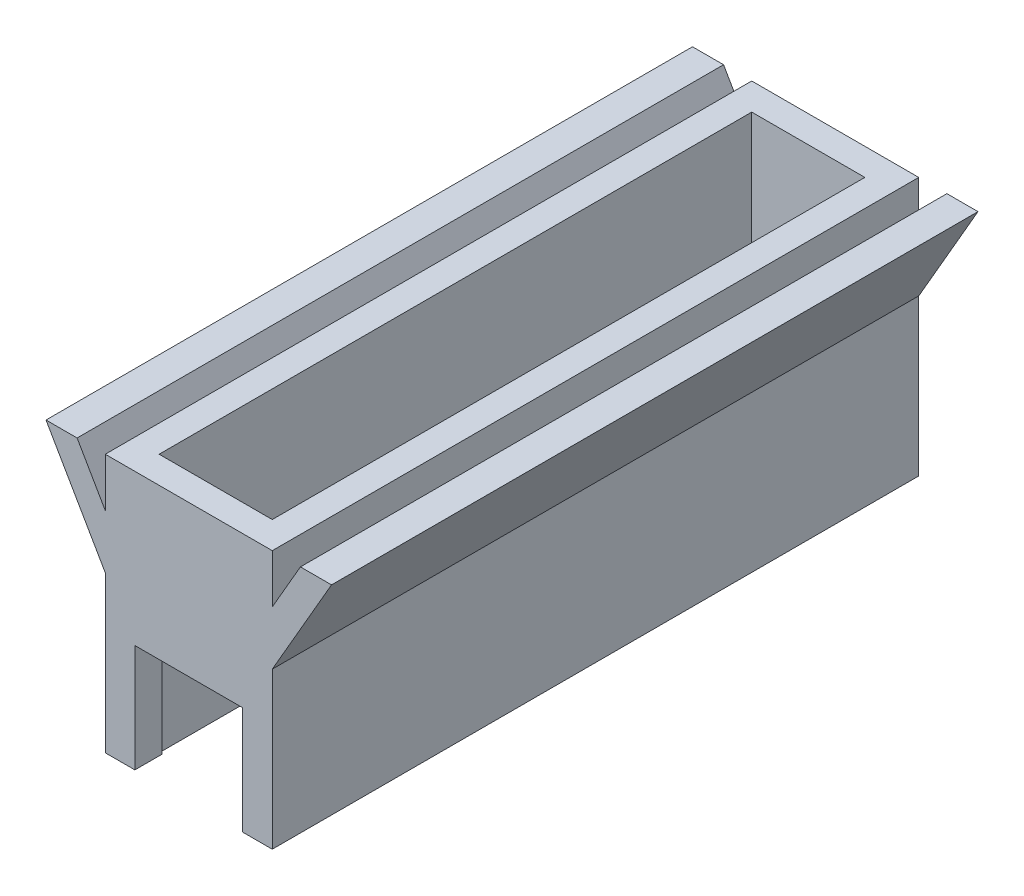
ISO-10303-21;
HEADER;
FILE_DESCRIPTION(('STEP AP214'),'2;1');
FILE_NAME('part.step','',(''),(''),'','','');
FILE_SCHEMA(('AUTOMOTIVE_DESIGN { 1 0 10303 214 1 1 1 1 }'));
ENDSEC;
DATA;
#1=APPLICATION_CONTEXT('core data for automotive mechanical design processes');
#2=APPLICATION_PROTOCOL_DEFINITION('international standard','automotive_design',2000,#1);
#3=PRODUCT_CONTEXT('',#1,'mechanical');
#4=PRODUCT('Part','Part','',(#3));
#5=PRODUCT_RELATED_PRODUCT_CATEGORY('part','',(#4));
#6=PRODUCT_DEFINITION_FORMATION('','',#4);
#7=PRODUCT_DEFINITION_CONTEXT('part definition',#1,'design');
#8=PRODUCT_DEFINITION('design','',#6,#7);
#9=PRODUCT_DEFINITION_SHAPE('','',#8);
#10=(LENGTH_UNIT() NAMED_UNIT(*) SI_UNIT(.MILLI.,.METRE.));
#11=(NAMED_UNIT(*) PLANE_ANGLE_UNIT() SI_UNIT($,.RADIAN.));
#12=(NAMED_UNIT(*) SI_UNIT($,.STERADIAN.) SOLID_ANGLE_UNIT());
#13=UNCERTAINTY_MEASURE_WITH_UNIT(LENGTH_MEASURE(1.E-05),#10,'distance_accuracy_value','');
#14=(GEOMETRIC_REPRESENTATION_CONTEXT(3) GLOBAL_UNCERTAINTY_ASSIGNED_CONTEXT((#13)) GLOBAL_UNIT_ASSIGNED_CONTEXT((#10,
#11,#12)) REPRESENTATION_CONTEXT('',''));
#15=CARTESIAN_POINT('',(0.,0.,0.));
#16=DIRECTION('',(0.,0.,1.));
#17=DIRECTION('',(1.,0.,0.));
#18=AXIS2_PLACEMENT_3D('',#15,#16,#17);
#19=CARTESIAN_POINT('',(24.2592802955411,48.,-4.99202551834131));
#20=DIRECTION('',(-1.,0.,0.));
#21=DIRECTION('',(0.,0.,1.));
#22=AXIS2_PLACEMENT_3D('',#19,#20,#21);
#23=PLANE('',#22);
#24=DIRECTION('',(0.,0.,1.));
#25=VECTOR('',#24,1.);
#26=CARTESIAN_POINT('',(24.2592802955411,38.9474411167422,-4.99202551834139));
#27=LINE('',#26,#25);
#28=CARTESIAN_POINT('',(24.2592802955411,38.9474411167422,-4.99202551834139));
#29=VERTEX_POINT('',#28);
#30=CARTESIAN_POINT('',(24.2592802955411,38.9474411167422,115.007974481659));
#31=VERTEX_POINT('',#30);
#32=EDGE_CURVE('E202',#29,#31,#27,.T.);
#33=ORIENTED_EDGE('',*,*,#32,.F.);
#34=DIRECTION('',(0.,-1.,0.));
#35=VECTOR('',#34,1.);
#36=CARTESIAN_POINT('',(24.2592802955411,48.,-4.99202551834131));
#37=LINE('',#36,#35);
#38=CARTESIAN_POINT('',(24.2592802955411,48.,-4.99202551834131));
#39=VERTEX_POINT('',#38);
#40=EDGE_CURVE('E215',#39,#29,#37,.T.);
#41=ORIENTED_EDGE('',*,*,#40,.F.);
#42=DIRECTION('',(0.,0.,-1.));
#43=VECTOR('',#42,1.);
#44=CARTESIAN_POINT('',(24.2592802955411,48.,-4.99202551834131));
#45=LINE('',#44,#43);
#46=CARTESIAN_POINT('',(24.2592802955411,48.,115.007974481659));
#47=VERTEX_POINT('',#46);
#48=EDGE_CURVE('E327',#47,#39,#45,.T.);
#49=ORIENTED_EDGE('',*,*,#48,.F.);
#50=DIRECTION('',(0.,-1.,0.));
#51=VECTOR('',#50,1.);
#52=CARTESIAN_POINT('',(24.2592802955411,48.,115.007974481659));
#53=LINE('',#52,#51);
#54=EDGE_CURVE('E218',#47,#31,#53,.T.);
#55=ORIENTED_EDGE('',*,*,#54,.T.);
#56=EDGE_LOOP('',(#33,#41,#49,#55));
#57=FACE_BOUND('',#56,.T.);
#58=ADVANCED_FACE('F38',(#57),#23,.F.);
#59=CARTESIAN_POINT('',(-6.74071970445887,48.,-4.99202551834131));
#60=DIRECTION('',(1.,0.,0.));
#61=DIRECTION('',(0.,0.,-1.));
#62=AXIS2_PLACEMENT_3D('',#59,#60,#61);
#63=PLANE('',#62);
#64=DIRECTION('',(0.,0.,1.));
#65=VECTOR('',#64,1.);
#66=CARTESIAN_POINT('',(-6.74071970445886,28.9474411167421,-4.99202551834139));
#67=LINE('',#66,#65);
#68=CARTESIAN_POINT('',(-6.74071970445886,28.9474411167421,-4.99202551834139));
#69=VERTEX_POINT('',#68);
#70=CARTESIAN_POINT('',(-6.74071970445886,28.9474411167421,115.007974481659));
#71=VERTEX_POINT('',#70);
#72=EDGE_CURVE('E355',#69,#71,#67,.T.);
#73=ORIENTED_EDGE('',*,*,#72,.F.);
#74=DIRECTION('',(0.,-1.,0.));
#75=VECTOR('',#74,1.);
#76=CARTESIAN_POINT('',(-6.74071970445887,48.,-4.99202551834131));
#77=LINE('',#76,#75);
#78=CARTESIAN_POINT('',(-6.74071970445887,0.,-4.99202551834131));
#79=VERTEX_POINT('',#78);
#80=EDGE_CURVE('E330',#69,#79,#77,.T.);
#81=ORIENTED_EDGE('',*,*,#80,.T.);
#82=DIRECTION('',(0.,0.,1.));
#83=VECTOR('',#82,1.);
#84=CARTESIAN_POINT('',(-6.74071970445887,0.,-4.99202551834131));
#85=LINE('',#84,#83);
#86=CARTESIAN_POINT('',(-6.74071970445886,0.,115.007974481659));
#87=VERTEX_POINT('',#86);
#88=EDGE_CURVE('E320',#79,#87,#85,.T.);
#89=ORIENTED_EDGE('',*,*,#88,.T.);
#90=DIRECTION('',(0.,-1.,0.));
#91=VECTOR('',#90,1.);
#92=CARTESIAN_POINT('',(-6.74071970445886,48.,115.007974481659));
#93=LINE('',#92,#91);
#94=EDGE_CURVE('E234',#71,#87,#93,.T.);
#95=ORIENTED_EDGE('',*,*,#94,.F.);
#96=EDGE_LOOP('',(#73,#81,#89,#95));
#97=FACE_BOUND('',#96,.T.);
#98=ADVANCED_FACE('F354',(#97),#63,.F.);
#99=CARTESIAN_POINT('',(0.,0.,0.));
#100=DIRECTION('',(0.,1.,0.));
#101=DIRECTION('',(0.,0.,1.));
#102=AXIS2_PLACEMENT_3D('',#99,#100,#101);
#103=PLANE('',#102);
#104=DIRECTION('',(0.,0.,1.));
#105=VECTOR('',#104,1.);
#106=CARTESIAN_POINT('',(18.7592802955411,0.,-20.9920255183414));
#107=LINE('',#106,#105);
#108=CARTESIAN_POINT('',(18.7592802955411,0.,-4.99202551834131));
#109=VERTEX_POINT('',#108);
#110=CARTESIAN_POINT('',(18.7592802955411,0.,0.00797448165869297));
#111=VERTEX_POINT('',#110);
#112=EDGE_CURVE('E270',#109,#111,#107,.T.);
#113=ORIENTED_EDGE('',*,*,#112,.F.);
#114=DIRECTION('',(-1.,0.,0.));
#115=VECTOR('',#114,1.);
#116=CARTESIAN_POINT('',(-6.74071970445887,0.,-4.99202551834131));
#117=LINE('',#116,#115);
#118=CARTESIAN_POINT('',(24.2592802955411,0.,-4.99202551834131));
#119=VERTEX_POINT('',#118);
#120=EDGE_CURVE('E325',#119,#109,#117,.T.);
#121=ORIENTED_EDGE('',*,*,#120,.F.);
#122=DIRECTION('',(0.,0.,-1.));
#123=VECTOR('',#122,1.);
#124=CARTESIAN_POINT('',(24.2592802955411,0.,-4.99202551834131));
#125=LINE('',#124,#123);
#126=CARTESIAN_POINT('',(24.2592802955411,0.,115.007974481659));
#127=VERTEX_POINT('',#126);
#128=EDGE_CURVE('E337',#127,#119,#125,.T.);
#129=ORIENTED_EDGE('',*,*,#128,.F.);
#130=DIRECTION('',(1.,0.,0.));
#131=VECTOR('',#130,1.);
#132=CARTESIAN_POINT('',(-6.74071970445886,0.,115.007974481659));
#133=LINE('',#132,#131);
#134=CARTESIAN_POINT('',(18.7592802955411,0.,115.007974481659));
#135=VERTEX_POINT('',#134);
#136=EDGE_CURVE('E333',#135,#127,#133,.T.);
#137=ORIENTED_EDGE('',*,*,#136,.F.);
#138=CARTESIAN_POINT('',(18.7592802955411,0.,110.007974481659));
#139=VERTEX_POINT('',#138);
#140=EDGE_CURVE('E271',#139,#135,#107,.T.);
#141=ORIENTED_EDGE('',*,*,#140,.F.);
#142=DIRECTION('',(1.,0.,0.));
#143=VECTOR('',#142,1.);
#144=CARTESIAN_POINT('',(-1.74071970445887,0.,110.007974481659));
#145=LINE('',#144,#143);
#146=CARTESIAN_POINT('',(19.2592802955411,0.,110.007974481659));
#147=VERTEX_POINT('',#146);
#148=EDGE_CURVE('E301',#139,#147,#145,.T.);
#149=ORIENTED_EDGE('',*,*,#148,.T.);
#150=DIRECTION('',(0.,0.,-1.));
#151=VECTOR('',#150,1.);
#152=CARTESIAN_POINT('',(19.2592802955411,0.,0.00797448165869297));
#153=LINE('',#152,#151);
#154=CARTESIAN_POINT('',(19.2592802955411,0.,0.00797448165869297));
#155=VERTEX_POINT('',#154);
#156=EDGE_CURVE('E305',#147,#155,#153,.T.);
#157=ORIENTED_EDGE('',*,*,#156,.T.);
#158=DIRECTION('',(-1.,0.,0.));
#159=VECTOR('',#158,1.);
#160=CARTESIAN_POINT('',(-1.74071970445887,0.,0.00797448165869297));
#161=LINE('',#160,#159);
#162=EDGE_CURVE('E291',#155,#111,#161,.T.);
#163=ORIENTED_EDGE('',*,*,#162,.T.);
#164=EDGE_LOOP('',(#113,#121,#129,#137,#141,#149,#157,#163));
#165=FACE_BOUND('',#164,.T.);
#166=ADVANCED_FACE('F421',(#165),#103,.F.);
#167=CARTESIAN_POINT('',(0.,48.,0.));
#168=DIRECTION('',(0.,1.,0.));
#169=DIRECTION('',(0.,0.,1.));
#170=AXIS2_PLACEMENT_3D('',#167,#168,#169);
#171=PLANE('',#170);
#172=DIRECTION('',(0.,0.,1.));
#173=VECTOR('',#172,1.);
#174=CARTESIAN_POINT('',(-6.74071970445887,48.,-4.99202551834131));
#175=LINE('',#174,#173);
#176=CARTESIAN_POINT('',(-6.74071970445887,48.,-4.99202551834131));
#177=VERTEX_POINT('',#176);
#178=CARTESIAN_POINT('',(-6.74071970445886,48.,115.007974481659));
#179=VERTEX_POINT('',#178);
#180=EDGE_CURVE('E321',#177,#179,#175,.T.);
#181=ORIENTED_EDGE('',*,*,#180,.T.);
#182=DIRECTION('',(1.,0.,0.));
#183=VECTOR('',#182,1.);
#184=CARTESIAN_POINT('',(-6.74071970445886,48.,115.007974481659));
#185=LINE('',#184,#183);
#186=EDGE_CURVE('E324',#179,#47,#185,.T.);
#187=ORIENTED_EDGE('',*,*,#186,.T.);
#188=ORIENTED_EDGE('',*,*,#48,.T.);
#189=DIRECTION('',(-1.,0.,0.));
#190=VECTOR('',#189,1.);
#191=CARTESIAN_POINT('',(-6.74071970445887,48.,-4.99202551834131));
#192=LINE('',#191,#190);
#193=EDGE_CURVE('E225',#39,#177,#192,.T.);
#194=ORIENTED_EDGE('',*,*,#193,.T.);
#195=EDGE_LOOP('',(#181,#187,#188,#194));
#196=FACE_BOUND('',#195,.T.);
#197=DIRECTION('',(1.,0.,0.));
#198=VECTOR('',#197,1.);
#199=CARTESIAN_POINT('',(-1.74071970445887,48.,110.007974481659));
#200=LINE('',#199,#198);
#201=CARTESIAN_POINT('',(-1.74071970445887,48.,110.007974481659));
#202=VERTEX_POINT('',#201);
#203=CARTESIAN_POINT('',(19.2592802955411,48.,110.007974481659));
#204=VERTEX_POINT('',#203);
#205=EDGE_CURVE('E290',#202,#204,#200,.T.);
#206=ORIENTED_EDGE('',*,*,#205,.F.);
#207=DIRECTION('',(0.,0.,1.));
#208=VECTOR('',#207,1.);
#209=CARTESIAN_POINT('',(-1.74071970445887,48.,0.00797448165869297));
#210=LINE('',#209,#208);
#211=CARTESIAN_POINT('',(-1.74071970445887,48.,0.00797448165869297));
#212=VERTEX_POINT('',#211);
#213=EDGE_CURVE('E288',#212,#202,#210,.T.);
#214=ORIENTED_EDGE('',*,*,#213,.F.);
#215=DIRECTION('',(-1.,0.,0.));
#216=VECTOR('',#215,1.);
#217=CARTESIAN_POINT('',(-1.74071970445887,48.,0.00797448165869297));
#218=LINE('',#217,#216);
#219=CARTESIAN_POINT('',(19.2592802955411,48.,0.00797448165869297));
#220=VERTEX_POINT('',#219);
#221=EDGE_CURVE('E296',#220,#212,#218,.T.);
#222=ORIENTED_EDGE('',*,*,#221,.F.);
#223=DIRECTION('',(0.,0.,-1.));
#224=VECTOR('',#223,1.);
#225=CARTESIAN_POINT('',(19.2592802955411,48.,0.00797448165869297));
#226=LINE('',#225,#224);
#227=EDGE_CURVE('E293',#204,#220,#226,.T.);
#228=ORIENTED_EDGE('',*,*,#227,.F.);
#229=EDGE_LOOP('',(#206,#214,#222,#228));
#230=FACE_BOUND('',#229,.T.);
#231=ADVANCED_FACE('F490',(#196,#230),#171,.T.);
#232=CARTESIAN_POINT('',(-1.24071970445887,0.,-4.99202551834131));
#233=VERTEX_POINT('',#232);
#234=EDGE_CURVE('E339',#233,#79,#117,.T.);
#235=ORIENTED_EDGE('',*,*,#234,.F.);
#236=DIRECTION('',(0.,0.,1.));
#237=VECTOR('',#236,1.);
#238=CARTESIAN_POINT('',(-1.24071970445887,0.,-20.9920255183414));
#239=LINE('',#238,#237);
#240=CARTESIAN_POINT('',(-1.24071970445887,0.,0.00797448165869297));
#241=VERTEX_POINT('',#240);
#242=EDGE_CURVE('E264',#233,#241,#239,.T.);
#243=ORIENTED_EDGE('',*,*,#242,.T.);
#244=CARTESIAN_POINT('',(-1.74071970445887,0.,0.00797448165869297));
#245=VERTEX_POINT('',#244);
#246=EDGE_CURVE('E308',#241,#245,#161,.T.);
#247=ORIENTED_EDGE('',*,*,#246,.T.);
#248=DIRECTION('',(0.,0.,1.));
#249=VECTOR('',#248,1.);
#250=CARTESIAN_POINT('',(-1.74071970445887,0.,0.00797448165869297));
#251=LINE('',#250,#249);
#252=CARTESIAN_POINT('',(-1.74071970445887,0.,110.007974481659));
#253=VERTEX_POINT('',#252);
#254=EDGE_CURVE('E287',#245,#253,#251,.T.);
#255=ORIENTED_EDGE('',*,*,#254,.T.);
#256=CARTESIAN_POINT('',(-1.24071970445887,0.,110.007974481659));
#257=VERTEX_POINT('',#256);
#258=EDGE_CURVE('E302',#253,#257,#145,.T.);
#259=ORIENTED_EDGE('',*,*,#258,.T.);
#260=CARTESIAN_POINT('',(-1.24071970445887,0.,115.007974481659));
#261=VERTEX_POINT('',#260);
#262=EDGE_CURVE('E260',#257,#261,#239,.T.);
#263=ORIENTED_EDGE('',*,*,#262,.T.);
#264=EDGE_CURVE('E334',#87,#261,#133,.T.);
#265=ORIENTED_EDGE('',*,*,#264,.F.);
#266=ORIENTED_EDGE('',*,*,#88,.F.);
#267=EDGE_LOOP('',(#235,#243,#247,#255,#259,#263,#265,#266));
#268=FACE_BOUND('',#267,.T.);
#269=ADVANCED_FACE('F350',(#268),#103,.F.);
#270=CARTESIAN_POINT('',(-6.74071970445886,38.9474411167422,-4.99202551834139));
#271=VERTEX_POINT('',#270);
#272=EDGE_CURVE('E230',#177,#271,#77,.T.);
#273=ORIENTED_EDGE('',*,*,#272,.T.);
#274=DIRECTION('',(0.,0.,1.));
#275=VECTOR('',#274,1.);
#276=CARTESIAN_POINT('',(-6.74071970445886,38.9474411167422,-4.99202551834139));
#277=LINE('',#276,#275);
#278=CARTESIAN_POINT('',(-6.74071970445886,38.9474411167422,115.007974481659));
#279=VERTEX_POINT('',#278);
#280=EDGE_CURVE('E360',#271,#279,#277,.T.);
#281=ORIENTED_EDGE('',*,*,#280,.T.);
#282=EDGE_CURVE('E235',#179,#279,#93,.T.);
#283=ORIENTED_EDGE('',*,*,#282,.F.);
#284=ORIENTED_EDGE('',*,*,#180,.F.);
#285=EDGE_LOOP('',(#273,#281,#283,#284));
#286=FACE_BOUND('',#285,.T.);
#287=ADVANCED_FACE('F40',(#286),#63,.F.);
#288=CARTESIAN_POINT('',(-6.74071970445886,48.,115.007974481659));
#289=DIRECTION('',(0.,0.,-1.));
#290=DIRECTION('',(-1.,0.,0.));
#291=AXIS2_PLACEMENT_3D('',#288,#289,#290);
#292=PLANE('',#291);
#293=ORIENTED_EDGE('',*,*,#264,.T.);
#294=DIRECTION('',(0.,-1.,0.));
#295=VECTOR('',#294,1.);
#296=CARTESIAN_POINT('',(-1.24071970445887,20.,115.007974481659));
#297=LINE('',#296,#295);
#298=CARTESIAN_POINT('',(-1.24071970445887,20.,115.007974481659));
#299=VERTEX_POINT('',#298);
#300=EDGE_CURVE('E273',#299,#261,#297,.T.);
#301=ORIENTED_EDGE('',*,*,#300,.F.);
#302=DIRECTION('',(1.,0.,0.));
#303=VECTOR('',#302,1.);
#304=CARTESIAN_POINT('',(-1.24071970445887,20.,115.007974481659));
#305=LINE('',#304,#303);
#306=CARTESIAN_POINT('',(18.7592802955411,20.,115.007974481659));
#307=VERTEX_POINT('',#306);
#308=EDGE_CURVE('E388',#299,#307,#305,.T.);
#309=ORIENTED_EDGE('',*,*,#308,.T.);
#310=DIRECTION('',(0.,-1.,0.));
#311=VECTOR('',#310,1.);
#312=CARTESIAN_POINT('',(18.7592802955411,20.,115.007974481659));
#313=LINE('',#312,#311);
#314=EDGE_CURVE('E381',#307,#135,#313,.T.);
#315=ORIENTED_EDGE('',*,*,#314,.T.);
#316=ORIENTED_EDGE('',*,*,#136,.T.);
#317=CARTESIAN_POINT('',(24.2592802955411,28.9474411167421,115.007974481659));
#318=VERTEX_POINT('',#317);
#319=EDGE_CURVE('E226',#318,#127,#53,.T.);
#320=ORIENTED_EDGE('',*,*,#319,.F.);
#321=DIRECTION('',(0.499999999999995,0.866025403784442,0.));
#322=VECTOR('',#321,1.);
#323=CARTESIAN_POINT('',(5.65985053082965,-3.2677162275475,115.007974481659));
#324=LINE('',#323,#322);
#325=CARTESIAN_POINT('',(35.2592802955411,48.,115.007974481659));
#326=VERTEX_POINT('',#325);
#327=EDGE_CURVE('E53',#318,#326,#324,.T.);
#328=ORIENTED_EDGE('',*,*,#327,.T.);
#329=DIRECTION('',(1.,0.,0.));
#330=VECTOR('',#329,1.);
#331=CARTESIAN_POINT('',(0.,48.,115.007974481659));
#332=LINE('',#331,#330);
#333=CARTESIAN_POINT('',(29.4857776036449,48.,115.007974481659));
#334=VERTEX_POINT('',#333);
#335=EDGE_CURVE('E209',#334,#326,#332,.T.);
#336=ORIENTED_EDGE('',*,*,#335,.F.);
#337=DIRECTION('',(0.499999999999995,0.866025403784442,0.));
#338=VECTOR('',#337,1.);
#339=CARTESIAN_POINT('',(1.32972351190745,-0.767716227547528,115.007974481659));
#340=LINE('',#339,#338);
#341=EDGE_CURVE('E439',#31,#334,#340,.T.);
#342=ORIENTED_EDGE('',*,*,#341,.F.);
#343=ORIENTED_EDGE('',*,*,#54,.F.);
#344=ORIENTED_EDGE('',*,*,#186,.F.);
#345=ORIENTED_EDGE('',*,*,#282,.T.);
#346=DIRECTION('',(-0.499999999999995,0.866025403784442,0.));
#347=VECTOR('',#346,1.);
#348=CARTESIAN_POINT('',(11.8091969314043,6.8180430272595,115.007974481659));
#349=LINE('',#348,#347);
#350=CARTESIAN_POINT('',(-11.9672170125626,48.,115.007974481659));
#351=VERTEX_POINT('',#350);
#352=EDGE_CURVE('E61',#279,#351,#349,.T.);
#353=ORIENTED_EDGE('',*,*,#352,.T.);
#354=DIRECTION('',(1.,0.,0.));
#355=VECTOR('',#354,1.);
#356=CARTESIAN_POINT('',(0.,48.,115.007974481659));
#357=LINE('',#356,#355);
#358=CARTESIAN_POINT('',(-17.7407197044589,48.,115.007974481659));
#359=VERTEX_POINT('',#358);
#360=EDGE_CURVE('E369',#359,#351,#357,.T.);
#361=ORIENTED_EDGE('',*,*,#360,.F.);
#362=DIRECTION('',(-0.499999999999995,0.866025403784442,0.));
#363=VECTOR('',#362,1.);
#364=CARTESIAN_POINT('',(7.47906991248214,4.31804302725953,115.007974481659));
#365=LINE('',#364,#363);
#366=EDGE_CURVE('E372',#71,#359,#365,.T.);
#367=ORIENTED_EDGE('',*,*,#366,.F.);
#368=ORIENTED_EDGE('',*,*,#94,.T.);
#369=EDGE_LOOP('',(#293,#301,#309,#315,#316,#320,#328,#336,#342,#343,#344,#345,#353,#361,#367,#368));
#370=FACE_BOUND('',#369,.T.);
#371=ADVANCED_FACE('F397',(#370),#292,.F.);
#372=CARTESIAN_POINT('',(24.2592802955411,28.9474411167421,-4.99202551834139));
#373=VERTEX_POINT('',#372);
#374=EDGE_CURVE('E227',#373,#119,#37,.T.);
#375=ORIENTED_EDGE('',*,*,#374,.F.);
#376=DIRECTION('',(0.,0.,1.));
#377=VECTOR('',#376,1.);
#378=CARTESIAN_POINT('',(24.2592802955411,28.9474411167421,-4.99202551834139));
#379=LINE('',#378,#377);
#380=EDGE_CURVE('E219',#373,#318,#379,.T.);
#381=ORIENTED_EDGE('',*,*,#380,.T.);
#382=ORIENTED_EDGE('',*,*,#319,.T.);
#383=ORIENTED_EDGE('',*,*,#128,.T.);
#384=EDGE_LOOP('',(#375,#381,#382,#383));
#385=FACE_BOUND('',#384,.T.);
#386=ADVANCED_FACE('F417',(#385),#23,.F.);
#387=CARTESIAN_POINT('',(-6.74071970445887,48.,-4.99202551834131));
#388=DIRECTION('',(0.,0.,1.));
#389=DIRECTION('',(1.,0.,0.));
#390=AXIS2_PLACEMENT_3D('',#387,#388,#389);
#391=PLANE('',#390);
#392=DIRECTION('',(1.,0.,0.));
#393=VECTOR('',#392,1.);
#394=CARTESIAN_POINT('',(-6.74071970445886,20.,-4.99202551834131));
#395=LINE('',#394,#393);
#396=CARTESIAN_POINT('',(-1.24071970445887,20.,-4.99202551834131));
#397=VERTEX_POINT('',#396);
#398=CARTESIAN_POINT('',(18.7592802955411,20.,-4.99202551834131));
#399=VERTEX_POINT('',#398);
#400=EDGE_CURVE('E282',#397,#399,#395,.T.);
#401=ORIENTED_EDGE('',*,*,#400,.F.);
#402=DIRECTION('',(0.,-1.,0.));
#403=VECTOR('',#402,1.);
#404=CARTESIAN_POINT('',(-1.24071970445887,48.,-4.99202551834131));
#405=LINE('',#404,#403);
#406=EDGE_CURVE('E259',#397,#233,#405,.T.);
#407=ORIENTED_EDGE('',*,*,#406,.T.);
#408=ORIENTED_EDGE('',*,*,#234,.T.);
#409=ORIENTED_EDGE('',*,*,#80,.F.);
#410=DIRECTION('',(-0.499999999999995,0.866025403784442,0.));
#411=VECTOR('',#410,1.);
#412=CARTESIAN_POINT('',(7.47906991248214,4.31804302725953,-4.99202551834139));
#413=LINE('',#412,#411);
#414=CARTESIAN_POINT('',(-17.7407197044589,48.,-4.99202551834139));
#415=VERTEX_POINT('',#414);
#416=EDGE_CURVE('E366',#69,#415,#413,.T.);
#417=ORIENTED_EDGE('',*,*,#416,.T.);
#418=DIRECTION('',(1.,0.,0.));
#419=VECTOR('',#418,1.);
#420=CARTESIAN_POINT('',(0.,48.,-4.99202551834139));
#421=LINE('',#420,#419);
#422=CARTESIAN_POINT('',(-11.9672170125626,48.,-4.99202551834139));
#423=VERTEX_POINT('',#422);
#424=EDGE_CURVE('E364',#415,#423,#421,.T.);
#425=ORIENTED_EDGE('',*,*,#424,.T.);
#426=DIRECTION('',(-0.499999999999995,0.866025403784442,0.));
#427=VECTOR('',#426,1.);
#428=CARTESIAN_POINT('',(11.8091969314043,6.8180430272595,-4.99202551834139));
#429=LINE('',#428,#427);
#430=EDGE_CURVE('E363',#271,#423,#429,.T.);
#431=ORIENTED_EDGE('',*,*,#430,.F.);
#432=ORIENTED_EDGE('',*,*,#272,.F.);
#433=ORIENTED_EDGE('',*,*,#193,.F.);
#434=ORIENTED_EDGE('',*,*,#40,.T.);
#435=DIRECTION('',(0.499999999999995,0.866025403784442,0.));
#436=VECTOR('',#435,1.);
#437=CARTESIAN_POINT('',(1.32972351190745,-0.767716227547528,-4.99202551834139));
#438=LINE('',#437,#436);
#439=CARTESIAN_POINT('',(29.4857776036449,48.,-4.99202551834139));
#440=VERTEX_POINT('',#439);
#441=EDGE_CURVE('E198',#29,#440,#438,.T.);
#442=ORIENTED_EDGE('',*,*,#441,.T.);
#443=DIRECTION('',(1.,0.,0.));
#444=VECTOR('',#443,1.);
#445=CARTESIAN_POINT('',(0.,48.,-4.99202551834139));
#446=LINE('',#445,#444);
#447=CARTESIAN_POINT('',(35.2592802955411,48.,-4.99202551834139));
#448=VERTEX_POINT('',#447);
#449=EDGE_CURVE('E220',#440,#448,#446,.T.);
#450=ORIENTED_EDGE('',*,*,#449,.T.);
#451=DIRECTION('',(0.499999999999995,0.866025403784442,0.));
#452=VECTOR('',#451,1.);
#453=CARTESIAN_POINT('',(5.65985053082965,-3.2677162275475,-4.99202551834139));
#454=LINE('',#453,#452);
#455=EDGE_CURVE('E208',#373,#448,#454,.T.);
#456=ORIENTED_EDGE('',*,*,#455,.F.);
#457=ORIENTED_EDGE('',*,*,#374,.T.);
#458=ORIENTED_EDGE('',*,*,#120,.T.);
#459=DIRECTION('',(0.,-1.,0.));
#460=VECTOR('',#459,1.);
#461=CARTESIAN_POINT('',(18.7592802955411,48.,-4.99202551834131));
#462=LINE('',#461,#460);
#463=EDGE_CURVE('E277',#399,#109,#462,.T.);
#464=ORIENTED_EDGE('',*,*,#463,.F.);
#465=EDGE_LOOP('',(#401,#407,#408,#409,#417,#425,#431,#432,#433,#434,#442,#450,#456,#457,#458,#464));
#466=FACE_BOUND('',#465,.T.);
#467=ADVANCED_FACE('F223',(#466),#391,.F.);
#468=CARTESIAN_POINT('',(-1.74071970445887,48.,0.00797448165869297));
#469=DIRECTION('',(1.,0.,0.));
#470=DIRECTION('',(0.,0.,-1.));
#471=AXIS2_PLACEMENT_3D('',#468,#469,#470);
#472=PLANE('',#471);
#473=ORIENTED_EDGE('',*,*,#254,.F.);
#474=DIRECTION('',(0.,-1.,0.));
#475=VECTOR('',#474,1.);
#476=CARTESIAN_POINT('',(-1.74071970445887,48.,0.00797448165869297));
#477=LINE('',#476,#475);
#478=EDGE_CURVE('E298',#212,#245,#477,.T.);
#479=ORIENTED_EDGE('',*,*,#478,.F.);
#480=ORIENTED_EDGE('',*,*,#213,.T.);
#481=DIRECTION('',(0.,-1.,0.));
#482=VECTOR('',#481,1.);
#483=CARTESIAN_POINT('',(-1.74071970445887,48.,110.007974481659));
#484=LINE('',#483,#482);
#485=EDGE_CURVE('E317',#202,#253,#484,.T.);
#486=ORIENTED_EDGE('',*,*,#485,.T.);
#487=EDGE_LOOP('',(#473,#479,#480,#486));
#488=FACE_BOUND('',#487,.T.);
#489=ADVANCED_FACE('F429',(#488),#472,.T.);
#490=CARTESIAN_POINT('',(-1.74071970445887,48.,110.007974481659));
#491=DIRECTION('',(0.,0.,-1.));
#492=DIRECTION('',(-1.,0.,0.));
#493=AXIS2_PLACEMENT_3D('',#490,#491,#492);
#494=PLANE('',#493);
#495=DIRECTION('',(0.,1.,0.));
#496=VECTOR('',#495,1.);
#497=CARTESIAN_POINT('',(-1.24071970445887,48.,110.007974481659));
#498=LINE('',#497,#496);
#499=CARTESIAN_POINT('',(-1.24071970445887,20.,110.007974481659));
#500=VERTEX_POINT('',#499);
#501=EDGE_CURVE('E284',#257,#500,#498,.T.);
#502=ORIENTED_EDGE('',*,*,#501,.F.);
#503=ORIENTED_EDGE('',*,*,#258,.F.);
#504=ORIENTED_EDGE('',*,*,#485,.F.);
#505=ORIENTED_EDGE('',*,*,#205,.T.);
#506=DIRECTION('',(0.,-1.,0.));
#507=VECTOR('',#506,1.);
#508=CARTESIAN_POINT('',(19.2592802955411,48.,110.007974481659));
#509=LINE('',#508,#507);
#510=EDGE_CURVE('E314',#204,#147,#509,.T.);
#511=ORIENTED_EDGE('',*,*,#510,.T.);
#512=ORIENTED_EDGE('',*,*,#148,.F.);
#513=DIRECTION('',(0.,1.,0.));
#514=VECTOR('',#513,1.);
#515=CARTESIAN_POINT('',(18.7592802955411,48.,110.007974481659));
#516=LINE('',#515,#514);
#517=CARTESIAN_POINT('',(18.7592802955411,20.,110.007974481659));
#518=VERTEX_POINT('',#517);
#519=EDGE_CURVE('E274',#139,#518,#516,.T.);
#520=ORIENTED_EDGE('',*,*,#519,.T.);
#521=DIRECTION('',(-1.,0.,0.));
#522=VECTOR('',#521,1.);
#523=CARTESIAN_POINT('',(-1.74071970445886,20.,110.007974481659));
#524=LINE('',#523,#522);
#525=EDGE_CURVE('E279',#518,#500,#524,.T.);
#526=ORIENTED_EDGE('',*,*,#525,.T.);
#527=EDGE_LOOP('',(#502,#503,#504,#505,#511,#512,#520,#526));
#528=FACE_BOUND('',#527,.T.);
#529=ADVANCED_FACE('F477',(#528),#494,.T.);
#530=CARTESIAN_POINT('',(19.2592802955411,48.,0.00797448165869297));
#531=DIRECTION('',(-1.,0.,0.));
#532=DIRECTION('',(0.,0.,1.));
#533=AXIS2_PLACEMENT_3D('',#530,#531,#532);
#534=PLANE('',#533);
#535=ORIENTED_EDGE('',*,*,#156,.F.);
#536=ORIENTED_EDGE('',*,*,#510,.F.);
#537=ORIENTED_EDGE('',*,*,#227,.T.);
#538=DIRECTION('',(0.,-1.,0.));
#539=VECTOR('',#538,1.);
#540=CARTESIAN_POINT('',(19.2592802955411,48.,0.00797448165869297));
#541=LINE('',#540,#539);
#542=EDGE_CURVE('E312',#220,#155,#541,.T.);
#543=ORIENTED_EDGE('',*,*,#542,.T.);
#544=EDGE_LOOP('',(#535,#536,#537,#543));
#545=FACE_BOUND('',#544,.T.);
#546=ADVANCED_FACE('F466',(#545),#534,.T.);
#547=CARTESIAN_POINT('',(-1.74071970445887,48.,0.00797448165869297));
#548=DIRECTION('',(0.,0.,1.));
#549=DIRECTION('',(1.,0.,0.));
#550=AXIS2_PLACEMENT_3D('',#547,#548,#549);
#551=PLANE('',#550);
#552=DIRECTION('',(0.,-1.,0.));
#553=VECTOR('',#552,1.);
#554=CARTESIAN_POINT('',(-1.24071970445887,48.,0.00797448165869297));
#555=LINE('',#554,#553);
#556=CARTESIAN_POINT('',(-1.24071970445887,20.,0.00797448165869297));
#557=VERTEX_POINT('',#556);
#558=EDGE_CURVE('E11',#557,#241,#555,.T.);
#559=ORIENTED_EDGE('',*,*,#558,.F.);
#560=DIRECTION('',(1.,0.,0.));
#561=VECTOR('',#560,1.);
#562=CARTESIAN_POINT('',(-1.74071970445886,20.,0.00797448165869297));
#563=LINE('',#562,#561);
#564=CARTESIAN_POINT('',(18.7592802955411,20.,0.00797448165869297));
#565=VERTEX_POINT('',#564);
#566=EDGE_CURVE('E46',#557,#565,#563,.T.);
#567=ORIENTED_EDGE('',*,*,#566,.T.);
#568=DIRECTION('',(0.,-1.,0.));
#569=VECTOR('',#568,1.);
#570=CARTESIAN_POINT('',(18.7592802955411,48.,0.00797448165869297));
#571=LINE('',#570,#569);
#572=EDGE_CURVE('E238',#565,#111,#571,.T.);
#573=ORIENTED_EDGE('',*,*,#572,.T.);
#574=ORIENTED_EDGE('',*,*,#162,.F.);
#575=ORIENTED_EDGE('',*,*,#542,.F.);
#576=ORIENTED_EDGE('',*,*,#221,.T.);
#577=ORIENTED_EDGE('',*,*,#478,.T.);
#578=ORIENTED_EDGE('',*,*,#246,.F.);
#579=EDGE_LOOP('',(#559,#567,#573,#574,#575,#576,#577,#578));
#580=FACE_BOUND('',#579,.T.);
#581=ADVANCED_FACE('F243',(#580),#551,.T.);
#582=CARTESIAN_POINT('',(18.7592802955411,20.,-20.9920255183414));
#583=DIRECTION('',(-1.,0.,0.));
#584=DIRECTION('',(0.,-1.,0.));
#585=AXIS2_PLACEMENT_3D('',#582,#583,#584);
#586=PLANE('',#585);
#587=ORIENTED_EDGE('',*,*,#463,.T.);
#588=ORIENTED_EDGE('',*,*,#112,.T.);
#589=ORIENTED_EDGE('',*,*,#572,.F.);
#590=DIRECTION('',(0.,0.,1.));
#591=VECTOR('',#590,1.);
#592=CARTESIAN_POINT('',(18.7592802955411,20.,-20.9920255183414));
#593=LINE('',#592,#591);
#594=EDGE_CURVE('E254',#399,#565,#593,.T.);
#595=ORIENTED_EDGE('',*,*,#594,.F.);
#596=EDGE_LOOP('',(#587,#588,#589,#595));
#597=FACE_BOUND('',#596,.T.);
#598=ADVANCED_FACE('F456',(#597),#586,.T.);
#599=CARTESIAN_POINT('',(-1.24071970445887,20.,-20.9920255183414));
#600=DIRECTION('',(0.,-1.,0.));
#601=DIRECTION('',(1.,0.,0.));
#602=AXIS2_PLACEMENT_3D('',#599,#600,#601);
#603=PLANE('',#602);
#604=ORIENTED_EDGE('',*,*,#400,.T.);
#605=ORIENTED_EDGE('',*,*,#594,.T.);
#606=ORIENTED_EDGE('',*,*,#566,.F.);
#607=DIRECTION('',(0.,0.,1.));
#608=VECTOR('',#607,1.);
#609=CARTESIAN_POINT('',(-1.24071970445887,20.,-20.9920255183414));
#610=LINE('',#609,#608);
#611=EDGE_CURVE('E252',#397,#557,#610,.T.);
#612=ORIENTED_EDGE('',*,*,#611,.F.);
#613=EDGE_LOOP('',(#604,#605,#606,#612));
#614=FACE_BOUND('',#613,.T.);
#615=ADVANCED_FACE('F251',(#614),#603,.T.);
#616=CARTESIAN_POINT('',(-1.24071970445887,20.,-20.9920255183414));
#617=DIRECTION('',(-1.,0.,0.));
#618=DIRECTION('',(0.,0.,1.));
#619=AXIS2_PLACEMENT_3D('',#616,#617,#618);
#620=PLANE('',#619);
#621=ORIENTED_EDGE('',*,*,#611,.T.);
#622=ORIENTED_EDGE('',*,*,#558,.T.);
#623=ORIENTED_EDGE('',*,*,#242,.F.);
#624=ORIENTED_EDGE('',*,*,#406,.F.);
#625=EDGE_LOOP('',(#621,#622,#623,#624));
#626=FACE_BOUND('',#625,.T.);
#627=ADVANCED_FACE('F256',(#626),#620,.F.);
#628=ORIENTED_EDGE('',*,*,#501,.T.);
#629=EDGE_CURVE('E261',#500,#299,#610,.T.);
#630=ORIENTED_EDGE('',*,*,#629,.T.);
#631=ORIENTED_EDGE('',*,*,#300,.T.);
#632=ORIENTED_EDGE('',*,*,#262,.F.);
#633=EDGE_LOOP('',(#628,#630,#631,#632));
#634=FACE_BOUND('',#633,.T.);
#635=ADVANCED_FACE('F392',(#634),#620,.F.);
#636=EDGE_CURVE('E268',#518,#307,#593,.T.);
#637=ORIENTED_EDGE('',*,*,#636,.T.);
#638=ORIENTED_EDGE('',*,*,#308,.F.);
#639=ORIENTED_EDGE('',*,*,#629,.F.);
#640=ORIENTED_EDGE('',*,*,#525,.F.);
#641=EDGE_LOOP('',(#637,#638,#639,#640));
#642=FACE_BOUND('',#641,.T.);
#643=ADVANCED_FACE('F465',(#642),#603,.T.);
#644=ORIENTED_EDGE('',*,*,#140,.T.);
#645=ORIENTED_EDGE('',*,*,#314,.F.);
#646=ORIENTED_EDGE('',*,*,#636,.F.);
#647=ORIENTED_EDGE('',*,*,#519,.F.);
#648=EDGE_LOOP('',(#644,#645,#646,#647));
#649=FACE_BOUND('',#648,.T.);
#650=ADVANCED_FACE('F459',(#649),#586,.T.);
#651=CARTESIAN_POINT('',(7.47906991248214,4.31804302725953,-4.99202551834139));
#652=DIRECTION('',(0.866025403784442,0.499999999999995,0.));
#653=DIRECTION('',(-0.499999999999995,0.866025403784442,0.));
#654=AXIS2_PLACEMENT_3D('',#651,#652,#653);
#655=PLANE('',#654);
#656=ORIENTED_EDGE('',*,*,#366,.T.);
#657=DIRECTION('',(0.,0.,1.));
#658=VECTOR('',#657,1.);
#659=CARTESIAN_POINT('',(-17.7407197044589,48.,-4.99202551834139));
#660=LINE('',#659,#658);
#661=EDGE_CURVE('E378',#415,#359,#660,.T.);
#662=ORIENTED_EDGE('',*,*,#661,.F.);
#663=ORIENTED_EDGE('',*,*,#416,.F.);
#664=ORIENTED_EDGE('',*,*,#72,.T.);
#665=EDGE_LOOP('',(#656,#662,#663,#664));
#666=FACE_BOUND('',#665,.T.);
#667=ADVANCED_FACE('F401',(#666),#655,.F.);
#668=CARTESIAN_POINT('',(0.,48.,-4.99202551834139));
#669=DIRECTION('',(0.,-1.,0.));
#670=DIRECTION('',(0.,0.,-1.));
#671=AXIS2_PLACEMENT_3D('',#668,#669,#670);
#672=PLANE('',#671);
#673=ORIENTED_EDGE('',*,*,#360,.T.);
#674=DIRECTION('',(0.,0.,1.));
#675=VECTOR('',#674,1.);
#676=CARTESIAN_POINT('',(-11.9672170125626,48.,-4.99202551834139));
#677=LINE('',#676,#675);
#678=EDGE_CURVE('E382',#423,#351,#677,.T.);
#679=ORIENTED_EDGE('',*,*,#678,.F.);
#680=ORIENTED_EDGE('',*,*,#424,.F.);
#681=ORIENTED_EDGE('',*,*,#661,.T.);
#682=EDGE_LOOP('',(#673,#679,#680,#681));
#683=FACE_BOUND('',#682,.T.);
#684=ADVANCED_FACE('F403',(#683),#672,.F.);
#685=CARTESIAN_POINT('',(11.8091969314043,6.8180430272595,-4.99202551834139));
#686=DIRECTION('',(0.866025403784442,0.499999999999995,0.));
#687=DIRECTION('',(-0.499999999999995,0.866025403784442,0.));
#688=AXIS2_PLACEMENT_3D('',#685,#686,#687);
#689=PLANE('',#688);
#690=ORIENTED_EDGE('',*,*,#352,.F.);
#691=ORIENTED_EDGE('',*,*,#280,.F.);
#692=ORIENTED_EDGE('',*,*,#430,.T.);
#693=ORIENTED_EDGE('',*,*,#678,.T.);
#694=EDGE_LOOP('',(#690,#691,#692,#693));
#695=FACE_BOUND('',#694,.T.);
#696=ADVANCED_FACE('F404',(#695),#689,.T.);
#697=CARTESIAN_POINT('',(1.32972351190745,-0.767716227547528,-4.99202551834139));
#698=DIRECTION('',(0.866025403784442,-0.499999999999995,0.));
#699=DIRECTION('',(0.499999999999995,0.866025403784442,0.));
#700=AXIS2_PLACEMENT_3D('',#697,#698,#699);
#701=PLANE('',#700);
#702=ORIENTED_EDGE('',*,*,#341,.T.);
#703=DIRECTION('',(0.,0.,1.));
#704=VECTOR('',#703,1.);
#705=CARTESIAN_POINT('',(29.4857776036449,48.,-4.99202551834139));
#706=LINE('',#705,#704);
#707=EDGE_CURVE('E205',#440,#334,#706,.T.);
#708=ORIENTED_EDGE('',*,*,#707,.F.);
#709=ORIENTED_EDGE('',*,*,#441,.F.);
#710=ORIENTED_EDGE('',*,*,#32,.T.);
#711=EDGE_LOOP('',(#702,#708,#709,#710));
#712=FACE_BOUND('',#711,.T.);
#713=ADVANCED_FACE('F201',(#712),#701,.F.);
#714=CARTESIAN_POINT('',(0.,48.,-4.99202551834139));
#715=DIRECTION('',(0.,-1.,0.));
#716=DIRECTION('',(0.,0.,-1.));
#717=AXIS2_PLACEMENT_3D('',#714,#715,#716);
#718=PLANE('',#717);
#719=ORIENTED_EDGE('',*,*,#335,.T.);
#720=DIRECTION('',(0.,0.,1.));
#721=VECTOR('',#720,1.);
#722=CARTESIAN_POINT('',(35.2592802955411,48.,-4.99202551834139));
#723=LINE('',#722,#721);
#724=EDGE_CURVE('E445',#448,#326,#723,.T.);
#725=ORIENTED_EDGE('',*,*,#724,.F.);
#726=ORIENTED_EDGE('',*,*,#449,.F.);
#727=ORIENTED_EDGE('',*,*,#707,.T.);
#728=EDGE_LOOP('',(#719,#725,#726,#727));
#729=FACE_BOUND('',#728,.T.);
#730=ADVANCED_FACE('F411',(#729),#718,.F.);
#731=CARTESIAN_POINT('',(5.65985053082965,-3.2677162275475,-4.99202551834139));
#732=DIRECTION('',(0.866025403784442,-0.499999999999995,0.));
#733=DIRECTION('',(0.499999999999995,0.866025403784442,0.));
#734=AXIS2_PLACEMENT_3D('',#731,#732,#733);
#735=PLANE('',#734);
#736=ORIENTED_EDGE('',*,*,#327,.F.);
#737=ORIENTED_EDGE('',*,*,#380,.F.);
#738=ORIENTED_EDGE('',*,*,#455,.T.);
#739=ORIENTED_EDGE('',*,*,#724,.T.);
#740=EDGE_LOOP('',(#736,#737,#738,#739));
#741=FACE_BOUND('',#740,.T.);
#742=ADVANCED_FACE('F447',(#741),#735,.T.);
#743=CLOSED_SHELL('',(#58,#98,#166,#231,#269,#287,#371,#386,#467,#489,#529,#546,#581,#598,#615,
#627,#635,#643,#650,#667,#684,#696,#713,#730,#742));
#744=MANIFOLD_SOLID_BREP('B2',#743);
#745=ADVANCED_BREP_SHAPE_REPRESENTATION('',(#18,#744),#14);
#746=SHAPE_DEFINITION_REPRESENTATION(#9,#745);
ENDSEC;
END-ISO-10303-21;
